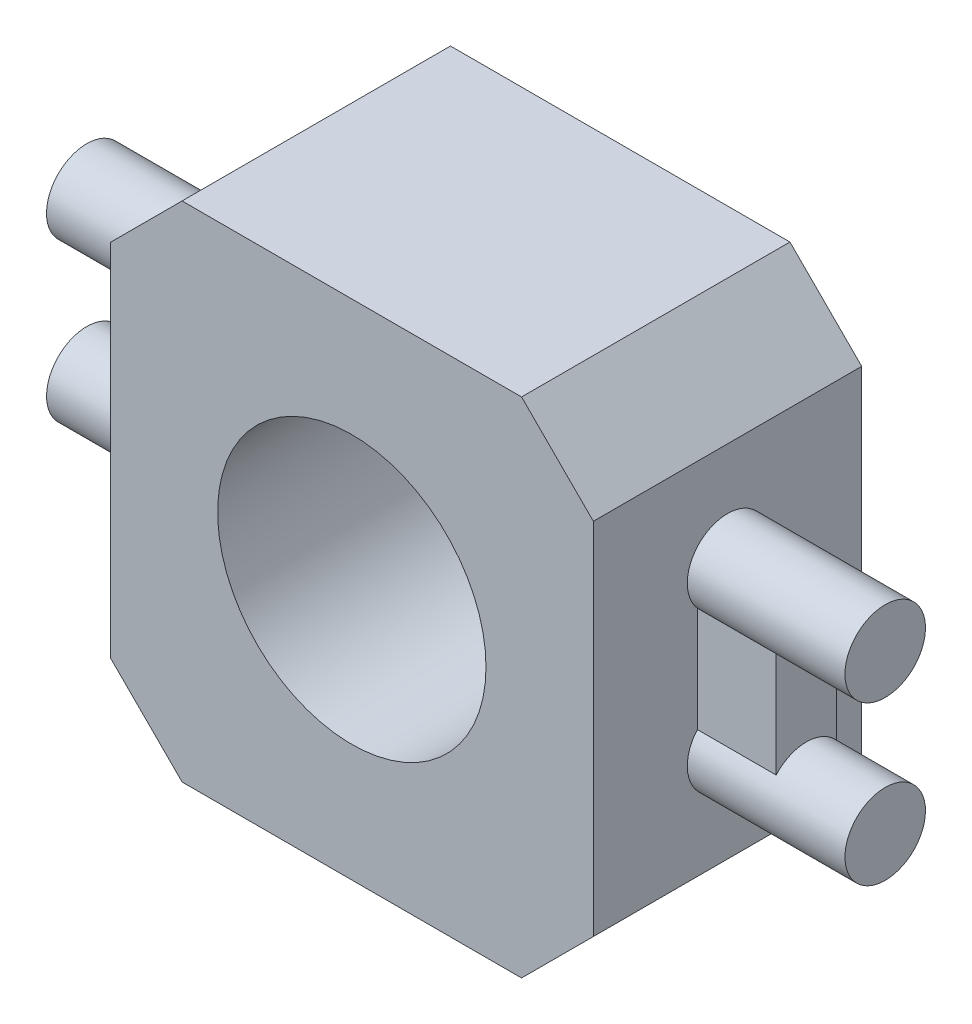
ISO-10303-21;
HEADER;
FILE_DESCRIPTION(('STEP AP214'),'2;1');
FILE_NAME('part.step','',(''),(''),'','','');
FILE_SCHEMA(('AUTOMOTIVE_DESIGN { 1 0 10303 214 1 1 1 1 }'));
ENDSEC;
DATA;
#1=APPLICATION_CONTEXT('core data for automotive mechanical design processes');
#2=APPLICATION_PROTOCOL_DEFINITION('international standard','automotive_design',2000,#1);
#3=PRODUCT_CONTEXT('',#1,'mechanical');
#4=PRODUCT('Part','Part','',(#3));
#5=PRODUCT_RELATED_PRODUCT_CATEGORY('part','',(#4));
#6=PRODUCT_DEFINITION_FORMATION('','',#4);
#7=PRODUCT_DEFINITION_CONTEXT('part definition',#1,'design');
#8=PRODUCT_DEFINITION('design','',#6,#7);
#9=PRODUCT_DEFINITION_SHAPE('','',#8);
#10=(LENGTH_UNIT() NAMED_UNIT(*) SI_UNIT(.MILLI.,.METRE.));
#11=(NAMED_UNIT(*) PLANE_ANGLE_UNIT() SI_UNIT($,.RADIAN.));
#12=(NAMED_UNIT(*) SI_UNIT($,.STERADIAN.) SOLID_ANGLE_UNIT());
#13=UNCERTAINTY_MEASURE_WITH_UNIT(LENGTH_MEASURE(1.E-05),#10,'distance_accuracy_value','');
#14=(GEOMETRIC_REPRESENTATION_CONTEXT(3) GLOBAL_UNCERTAINTY_ASSIGNED_CONTEXT((#13)) GLOBAL_UNIT_ASSIGNED_CONTEXT((#10,
#11,#12)) REPRESENTATION_CONTEXT('',''));
#15=CARTESIAN_POINT('',(0.,0.,0.));
#16=DIRECTION('',(0.,0.,1.));
#17=DIRECTION('',(1.,0.,0.));
#18=AXIS2_PLACEMENT_3D('',#15,#16,#17);
#19=CARTESIAN_POINT('',(-4.775,-1.39569752974828,1.55036098040823));
#20=DIRECTION('',(0.,0.,1.));
#21=DIRECTION('',(1.,0.,0.));
#22=AXIS2_PLACEMENT_3D('',#19,#20,#21);
#23=PLANE('',#22);
#24=DIRECTION('',(0.,-1.,0.));
#25=VECTOR('',#24,1.);
#26=CARTESIAN_POINT('',(-3.6,-1.39569752974828,1.55036098040823));
#27=LINE('',#26,#25);
#28=CARTESIAN_POINT('',(-3.6,1.13649655993792,1.55036098040823));
#29=VERTEX_POINT('',#28);
#30=CARTESIAN_POINT('',(-3.6,-1.39569752974828,1.55036098040823));
#31=VERTEX_POINT('',#30);
#32=EDGE_CURVE('E118',#29,#31,#27,.T.);
#33=ORIENTED_EDGE('',*,*,#32,.T.);
#34=DIRECTION('',(1.,0.,0.));
#35=VECTOR('',#34,1.);
#36=CARTESIAN_POINT('',(-4.775,-1.39569752974828,1.55036098040823));
#37=LINE('',#36,#35);
#38=CARTESIAN_POINT('',(-4.775,-1.39569752974828,1.55036098040823));
#39=VERTEX_POINT('',#38);
#40=EDGE_CURVE('E12',#39,#31,#37,.T.);
#41=ORIENTED_EDGE('',*,*,#40,.F.);
#42=DIRECTION('',(0.,-1.,0.));
#43=VECTOR('',#42,1.);
#44=CARTESIAN_POINT('',(-4.775,-1.39569752974828,1.55036098040823));
#45=LINE('',#44,#43);
#46=CARTESIAN_POINT('',(-4.775,1.13649655993792,1.55036098040823));
#47=VERTEX_POINT('',#46);
#48=EDGE_CURVE('E107',#47,#39,#45,.T.);
#49=ORIENTED_EDGE('',*,*,#48,.F.);
#50=DIRECTION('',(1.,0.,0.));
#51=VECTOR('',#50,1.);
#52=CARTESIAN_POINT('',(-4.775,1.13649655993792,1.55036098040823));
#53=LINE('',#52,#51);
#54=EDGE_CURVE('E117',#47,#29,#53,.T.);
#55=ORIENTED_EDGE('',*,*,#54,.T.);
#56=EDGE_LOOP('',(#33,#41,#49,#55));
#57=FACE_BOUND('',#56,.T.);
#58=ADVANCED_FACE('F60',(#57),#23,.F.);
#59=CARTESIAN_POINT('',(-4.775,-1.39569752974828,2.45036098040823));
#60=DIRECTION('',(0.,1.,0.));
#61=DIRECTION('',(0.,0.,1.));
#62=AXIS2_PLACEMENT_3D('',#59,#60,#61);
#63=PLANE('',#62);
#64=DIRECTION('',(0.,0.,1.));
#65=VECTOR('',#64,1.);
#66=CARTESIAN_POINT('',(-3.6,-1.39569752974828,2.45036098040823));
#67=LINE('',#66,#65);
#68=CARTESIAN_POINT('',(-3.6,-1.39569752974828,2.45036098040823));
#69=VERTEX_POINT('',#68);
#70=EDGE_CURVE('E115',#31,#69,#67,.T.);
#71=ORIENTED_EDGE('',*,*,#70,.T.);
#72=DIRECTION('',(1.,0.,0.));
#73=VECTOR('',#72,1.);
#74=CARTESIAN_POINT('',(-4.775,-1.39569752974828,2.45036098040823));
#75=LINE('',#74,#73);
#76=CARTESIAN_POINT('',(-4.775,-1.39569752974828,2.45036098040823));
#77=VERTEX_POINT('',#76);
#78=EDGE_CURVE('E63',#77,#69,#75,.T.);
#79=ORIENTED_EDGE('',*,*,#78,.F.);
#80=DIRECTION('',(0.,0.,1.));
#81=VECTOR('',#80,1.);
#82=CARTESIAN_POINT('',(-4.775,-1.39569752974828,2.45036098040823));
#83=LINE('',#82,#81);
#84=EDGE_CURVE('E103',#39,#77,#83,.T.);
#85=ORIENTED_EDGE('',*,*,#84,.F.);
#86=ORIENTED_EDGE('',*,*,#40,.T.);
#87=EDGE_LOOP('',(#71,#79,#85,#86));
#88=FACE_BOUND('',#87,.T.);
#89=ADVANCED_FACE('F112',(#88),#63,.F.);
#90=CARTESIAN_POINT('',(-4.775,-1.39569752974828,2.45036098040823));
#91=DIRECTION('',(0.,0.,-1.));
#92=DIRECTION('',(-1.,0.,0.));
#93=AXIS2_PLACEMENT_3D('',#90,#91,#92);
#94=PLANE('',#93);
#95=DIRECTION('',(0.,1.,0.));
#96=VECTOR('',#95,1.);
#97=CARTESIAN_POINT('',(-3.6,-1.39569752974828,2.45036098040823));
#98=LINE('',#97,#96);
#99=CARTESIAN_POINT('',(-3.6,1.13649655993792,2.45036098040823));
#100=VERTEX_POINT('',#99);
#101=EDGE_CURVE('E89',#69,#100,#98,.T.);
#102=ORIENTED_EDGE('',*,*,#101,.T.);
#103=DIRECTION('',(1.,0.,0.));
#104=VECTOR('',#103,1.);
#105=CARTESIAN_POINT('',(-4.775,1.13649655993792,2.45036098040823));
#106=LINE('',#105,#104);
#107=CARTESIAN_POINT('',(-4.775,1.13649655993792,2.45036098040823));
#108=VERTEX_POINT('',#107);
#109=EDGE_CURVE('E114',#108,#100,#106,.T.);
#110=ORIENTED_EDGE('',*,*,#109,.F.);
#111=DIRECTION('',(0.,1.,0.));
#112=VECTOR('',#111,1.);
#113=CARTESIAN_POINT('',(-4.775,-1.39569752974828,2.45036098040823));
#114=LINE('',#113,#112);
#115=EDGE_CURVE('E106',#77,#108,#114,.T.);
#116=ORIENTED_EDGE('',*,*,#115,.F.);
#117=ORIENTED_EDGE('',*,*,#78,.T.);
#118=EDGE_LOOP('',(#102,#110,#116,#117));
#119=FACE_BOUND('',#118,.T.);
#120=ADVANCED_FACE('F111',(#119),#94,.F.);
#121=CARTESIAN_POINT('',(-4.775,1.13649655993792,2.45036098040823));
#122=DIRECTION('',(0.,-1.,0.));
#123=DIRECTION('',(0.,0.,-1.));
#124=AXIS2_PLACEMENT_3D('',#121,#122,#123);
#125=PLANE('',#124);
#126=DIRECTION('',(0.,0.,-1.));
#127=VECTOR('',#126,1.);
#128=CARTESIAN_POINT('',(-3.6,1.13649655993792,2.45036098040823));
#129=LINE('',#128,#127);
#130=EDGE_CURVE('E96',#100,#29,#129,.T.);
#131=ORIENTED_EDGE('',*,*,#130,.T.);
#132=ORIENTED_EDGE('',*,*,#54,.F.);
#133=DIRECTION('',(0.,0.,-1.));
#134=VECTOR('',#133,1.);
#135=CARTESIAN_POINT('',(-4.775,1.13649655993792,2.45036098040823));
#136=LINE('',#135,#134);
#137=EDGE_CURVE('E71',#108,#47,#136,.T.);
#138=ORIENTED_EDGE('',*,*,#137,.F.);
#139=ORIENTED_EDGE('',*,*,#109,.T.);
#140=EDGE_LOOP('',(#131,#132,#138,#139));
#141=FACE_BOUND('',#140,.T.);
#142=ADVANCED_FACE('F130',(#141),#125,.F.);
#143=CARTESIAN_POINT('',(-4.775,0.,0.));
#144=DIRECTION('',(-1.,0.,0.));
#145=DIRECTION('',(0.,-1.,0.));
#146=AXIS2_PLACEMENT_3D('',#143,#144,#145);
#147=PLANE('',#146);
#148=ORIENTED_EDGE('',*,*,#48,.T.);
#149=ORIENTED_EDGE('',*,*,#84,.T.);
#150=ORIENTED_EDGE('',*,*,#115,.T.);
#151=ORIENTED_EDGE('',*,*,#137,.T.);
#152=EDGE_LOOP('',(#148,#149,#150,#151));
#153=FACE_BOUND('',#152,.T.);
#154=ADVANCED_FACE('F102',(#153),#147,.T.);
#155=CARTESIAN_POINT('',(-3.6,0.,0.));
#156=DIRECTION('',(-1.,0.,0.));
#157=DIRECTION('',(0.,-1.,0.));
#158=AXIS2_PLACEMENT_3D('',#155,#156,#157);
#159=PLANE('',#158);
#160=ORIENTED_EDGE('',*,*,#32,.F.);
#161=ORIENTED_EDGE('',*,*,#130,.F.);
#162=ORIENTED_EDGE('',*,*,#101,.F.);
#163=ORIENTED_EDGE('',*,*,#70,.F.);
#164=EDGE_LOOP('',(#160,#161,#162,#163));
#165=FACE_BOUND('',#164,.T.);
#166=ADVANCED_FACE('F128',(#165),#159,.F.);
#167=CLOSED_SHELL('',(#58,#89,#120,#142,#154,#166));
#168=MANIFOLD_SOLID_BREP('B2',#167);
#169=CARTESIAN_POINT('',(3.6,2.68,4.));
#170=DIRECTION('',(-1.,0.,0.));
#171=DIRECTION('',(0.,-1.,0.));
#172=AXIS2_PLACEMENT_3D('',#169,#170,#171);
#173=PLANE('',#172);
#174=DIRECTION('',(0.,1.,0.));
#175=VECTOR('',#174,1.);
#176=CARTESIAN_POINT('',(3.6,2.68,0.));
#177=LINE('',#176,#175);
#178=CARTESIAN_POINT('',(3.6,-2.68,0.));
#179=VERTEX_POINT('',#178);
#180=CARTESIAN_POINT('',(3.6,2.68,0.));
#181=VERTEX_POINT('',#180);
#182=EDGE_CURVE('E394',#179,#181,#177,.T.);
#183=ORIENTED_EDGE('',*,*,#182,.T.);
#184=DIRECTION('',(0.,0.,-1.));
#185=VECTOR('',#184,1.);
#186=CARTESIAN_POINT('',(3.6,2.68,4.));
#187=LINE('',#186,#185);
#188=CARTESIAN_POINT('',(3.6,2.68,4.));
#189=VERTEX_POINT('',#188);
#190=EDGE_CURVE('E400',#189,#181,#187,.T.);
#191=ORIENTED_EDGE('',*,*,#190,.F.);
#192=DIRECTION('',(0.,1.,0.));
#193=VECTOR('',#192,1.);
#194=CARTESIAN_POINT('',(3.6,2.68,4.));
#195=LINE('',#194,#193);
#196=CARTESIAN_POINT('',(3.6,-2.68,4.));
#197=VERTEX_POINT('',#196);
#198=EDGE_CURVE('E370',#197,#189,#195,.T.);
#199=ORIENTED_EDGE('',*,*,#198,.F.);
#200=DIRECTION('',(0.,0.,-1.));
#201=VECTOR('',#200,1.);
#202=CARTESIAN_POINT('',(3.6,-2.68,4.));
#203=LINE('',#202,#201);
#204=EDGE_CURVE('E404',#197,#179,#203,.T.);
#205=ORIENTED_EDGE('',*,*,#204,.T.);
#206=EDGE_LOOP('',(#183,#191,#199,#205));
#207=FACE_BOUND('',#206,.T.);
#208=DIRECTION('',(0.,1.,0.));
#209=VECTOR('',#208,1.);
#210=CARTESIAN_POINT('',(3.6,-1.16308127479022,1.55));
#211=LINE('',#210,#209);
#212=CARTESIAN_POINT('',(3.6,-0.783137303340311,1.55));
#213=VERTEX_POINT('',#212);
#214=CARTESIAN_POINT('',(3.6,0.783137303340313,1.55));
#215=VERTEX_POINT('',#214);
#216=EDGE_CURVE('E300',#213,#215,#211,.T.);
#217=ORIENTED_EDGE('',*,*,#216,.F.);
#218=CARTESIAN_POINT('',(3.6,-1.18,2.));
#219=DIRECTION('',(1.,0.,0.));
#220=DIRECTION('',(0.,1.,0.));
#221=AXIS2_PLACEMENT_3D('',#218,#219,#220);
#222=CIRCLE('',#221,0.6);
#223=CARTESIAN_POINT('',(3.6,-0.783137303340311,2.45));
#224=VERTEX_POINT('',#223);
#225=EDGE_CURVE('E316',#224,#213,#222,.T.);
#226=ORIENTED_EDGE('',*,*,#225,.F.);
#227=DIRECTION('',(0.,-1.,0.));
#228=VECTOR('',#227,1.);
#229=CARTESIAN_POINT('',(3.6,-1.16308127479022,2.45));
#230=LINE('',#229,#228);
#231=CARTESIAN_POINT('',(3.6,0.783137303340313,2.45));
#232=VERTEX_POINT('',#231);
#233=EDGE_CURVE('E293',#232,#224,#230,.T.);
#234=ORIENTED_EDGE('',*,*,#233,.F.);
#235=CARTESIAN_POINT('',(3.6,1.18,2.));
#236=DIRECTION('',(1.,0.,0.));
#237=DIRECTION('',(0.,1.,0.));
#238=AXIS2_PLACEMENT_3D('',#235,#236,#237);
#239=CIRCLE('',#238,0.6);
#240=EDGE_CURVE('E273',#215,#232,#239,.T.);
#241=ORIENTED_EDGE('',*,*,#240,.F.);
#242=EDGE_LOOP('',(#217,#226,#234,#241));
#243=FACE_BOUND('',#242,.T.);
#244=ADVANCED_FACE('F182',(#207,#243),#173,.F.);
#245=CARTESIAN_POINT('',(5.95,-1.18,2.));
#246=DIRECTION('',(-1.,0.,0.));
#247=DIRECTION('',(0.,-1.,0.));
#248=AXIS2_PLACEMENT_3D('',#245,#246,#247);
#249=CYLINDRICAL_SURFACE('',#248,0.6);
#250=CARTESIAN_POINT('',(5.95,-1.18,2.));
#251=DIRECTION('',(1.,0.,0.));
#252=DIRECTION('',(0.,1.,0.));
#253=AXIS2_PLACEMENT_3D('',#250,#251,#252);
#254=CIRCLE('',#253,0.6);
#255=CARTESIAN_POINT('',(5.95,-0.579999999999999,2.));
#256=VERTEX_POINT('',#255);
#257=EDGE_CURVE('E306',#256,#256,#254,.T.);
#258=ORIENTED_EDGE('',*,*,#257,.F.);
#259=EDGE_LOOP('',(#258));
#260=FACE_BOUND('',#259,.T.);
#261=DIRECTION('',(-1.,0.,0.));
#262=VECTOR('',#261,1.);
#263=CARTESIAN_POINT('',(5.95,-0.783137303340311,1.55));
#264=LINE('',#263,#262);
#265=CARTESIAN_POINT('',(4.775,-0.783137303340311,1.55));
#266=VERTEX_POINT('',#265);
#267=EDGE_CURVE('E197',#266,#213,#264,.T.);
#268=ORIENTED_EDGE('',*,*,#267,.F.);
#269=CARTESIAN_POINT('',(4.775,-1.18,2.));
#270=DIRECTION('',(-1.,0.,0.));
#271=DIRECTION('',(0.,0.,1.));
#272=AXIS2_PLACEMENT_3D('',#269,#270,#271);
#273=CIRCLE('',#272,0.6);
#274=CARTESIAN_POINT('',(4.775,-0.783137303340311,2.45));
#275=VERTEX_POINT('',#274);
#276=EDGE_CURVE('E203',#275,#266,#273,.T.);
#277=ORIENTED_EDGE('',*,*,#276,.F.);
#278=DIRECTION('',(-1.,0.,0.));
#279=VECTOR('',#278,1.);
#280=CARTESIAN_POINT('',(5.95,-0.78313730334031,2.45));
#281=LINE('',#280,#279);
#282=EDGE_CURVE('E288',#224,#275,#281,.F.);
#283=ORIENTED_EDGE('',*,*,#282,.F.);
#284=ORIENTED_EDGE('',*,*,#225,.T.);
#285=EDGE_LOOP('',(#268,#277,#283,#284));
#286=FACE_BOUND('',#285,.T.);
#287=ADVANCED_FACE('F478',(#260,#286),#249,.T.);
#288=CARTESIAN_POINT('',(5.95,1.18,2.));
#289=DIRECTION('',(-1.,0.,0.));
#290=DIRECTION('',(0.,-1.,0.));
#291=AXIS2_PLACEMENT_3D('',#288,#289,#290);
#292=CYLINDRICAL_SURFACE('',#291,0.6);
#293=CARTESIAN_POINT('',(5.95,1.18,2.));
#294=DIRECTION('',(1.,0.,0.));
#295=DIRECTION('',(0.,1.,0.));
#296=AXIS2_PLACEMENT_3D('',#293,#294,#295);
#297=CIRCLE('',#296,0.6);
#298=CARTESIAN_POINT('',(5.95,1.78,2.));
#299=VERTEX_POINT('',#298);
#300=EDGE_CURVE('E310',#299,#299,#297,.T.);
#301=ORIENTED_EDGE('',*,*,#300,.F.);
#302=EDGE_LOOP('',(#301));
#303=FACE_BOUND('',#302,.T.);
#304=DIRECTION('',(-1.,0.,0.));
#305=VECTOR('',#304,1.);
#306=CARTESIAN_POINT('',(5.95,0.783137303340314,1.55));
#307=LINE('',#306,#305);
#308=CARTESIAN_POINT('',(4.775,0.783137303340314,1.55));
#309=VERTEX_POINT('',#308);
#310=EDGE_CURVE('E54',#215,#309,#307,.F.);
#311=ORIENTED_EDGE('',*,*,#310,.F.);
#312=ORIENTED_EDGE('',*,*,#240,.T.);
#313=DIRECTION('',(-1.,0.,0.));
#314=VECTOR('',#313,1.);
#315=CARTESIAN_POINT('',(5.95,0.783137303340313,2.45));
#316=LINE('',#315,#314);
#317=CARTESIAN_POINT('',(4.775,0.783137303340313,2.45));
#318=VERTEX_POINT('',#317);
#319=EDGE_CURVE('E188',#318,#232,#316,.T.);
#320=ORIENTED_EDGE('',*,*,#319,.F.);
#321=CARTESIAN_POINT('',(4.775,1.18,2.));
#322=DIRECTION('',(-1.,0.,0.));
#323=DIRECTION('',(0.,0.,1.));
#324=AXIS2_PLACEMENT_3D('',#321,#322,#323);
#325=CIRCLE('',#324,0.6);
#326=EDGE_CURVE('E275',#309,#318,#325,.T.);
#327=ORIENTED_EDGE('',*,*,#326,.F.);
#328=EDGE_LOOP('',(#311,#312,#320,#327));
#329=FACE_BOUND('',#328,.T.);
#330=ADVANCED_FACE('F271',(#303,#329),#292,.T.);
#331=CARTESIAN_POINT('',(2.53,3.75,4.));
#332=DIRECTION('',(0.,-1.,0.));
#333=DIRECTION('',(1.,0.,0.));
#334=AXIS2_PLACEMENT_3D('',#331,#332,#333);
#335=PLANE('',#334);
#336=DIRECTION('',(-1.,0.,0.));
#337=VECTOR('',#336,1.);
#338=CARTESIAN_POINT('',(2.53,3.75,0.));
#339=LINE('',#338,#337);
#340=CARTESIAN_POINT('',(2.53,3.75,0.));
#341=VERTEX_POINT('',#340);
#342=CARTESIAN_POINT('',(-2.53,3.75,0.));
#343=VERTEX_POINT('',#342);
#344=EDGE_CURVE('E344',#341,#343,#339,.T.);
#345=ORIENTED_EDGE('',*,*,#344,.T.);
#346=DIRECTION('',(0.,0.,-1.));
#347=VECTOR('',#346,1.);
#348=CARTESIAN_POINT('',(-2.53,3.75,4.));
#349=LINE('',#348,#347);
#350=CARTESIAN_POINT('',(-2.53,3.75,4.));
#351=VERTEX_POINT('',#350);
#352=EDGE_CURVE('E333',#351,#343,#349,.T.);
#353=ORIENTED_EDGE('',*,*,#352,.F.);
#354=DIRECTION('',(-1.,0.,0.));
#355=VECTOR('',#354,1.);
#356=CARTESIAN_POINT('',(2.53,3.75,4.));
#357=LINE('',#356,#355);
#358=CARTESIAN_POINT('',(2.53,3.75,4.));
#359=VERTEX_POINT('',#358);
#360=EDGE_CURVE('E350',#359,#351,#357,.T.);
#361=ORIENTED_EDGE('',*,*,#360,.F.);
#362=DIRECTION('',(0.,0.,-1.));
#363=VECTOR('',#362,1.);
#364=CARTESIAN_POINT('',(2.53,3.75,4.));
#365=LINE('',#364,#363);
#366=EDGE_CURVE('E373',#359,#341,#365,.T.);
#367=ORIENTED_EDGE('',*,*,#366,.T.);
#368=EDGE_LOOP('',(#345,#353,#361,#367));
#369=FACE_BOUND('',#368,.T.);
#370=ADVANCED_FACE('F181',(#369),#335,.F.);
#371=CARTESIAN_POINT('',(-2.53,3.75,4.));
#372=DIRECTION('',(0.707106781186547,-0.707106781186547,0.));
#373=DIRECTION('',(0.707106781186548,0.707106781186548,0.));
#374=AXIS2_PLACEMENT_3D('',#371,#372,#373);
#375=PLANE('',#374);
#376=DIRECTION('',(-0.707106781186548,-0.707106781186548,0.));
#377=VECTOR('',#376,1.);
#378=CARTESIAN_POINT('',(-2.53,3.75,0.));
#379=LINE('',#378,#377);
#380=CARTESIAN_POINT('',(-3.6,2.68,0.));
#381=VERTEX_POINT('',#380);
#382=EDGE_CURVE('E380',#343,#381,#379,.T.);
#383=ORIENTED_EDGE('',*,*,#382,.T.);
#384=DIRECTION('',(0.,0.,-1.));
#385=VECTOR('',#384,1.);
#386=CARTESIAN_POINT('',(-3.6,2.68,4.));
#387=LINE('',#386,#385);
#388=CARTESIAN_POINT('',(-3.6,2.68,4.));
#389=VERTEX_POINT('',#388);
#390=EDGE_CURVE('E419',#389,#381,#387,.T.);
#391=ORIENTED_EDGE('',*,*,#390,.F.);
#392=DIRECTION('',(-0.707106781186548,-0.707106781186548,0.));
#393=VECTOR('',#392,1.);
#394=CARTESIAN_POINT('',(-2.53,3.75,4.));
#395=LINE('',#394,#393);
#396=EDGE_CURVE('E352',#351,#389,#395,.T.);
#397=ORIENTED_EDGE('',*,*,#396,.F.);
#398=ORIENTED_EDGE('',*,*,#352,.T.);
#399=EDGE_LOOP('',(#383,#391,#397,#398));
#400=FACE_BOUND('',#399,.T.);
#401=ADVANCED_FACE('F428',(#400),#375,.F.);
#402=CARTESIAN_POINT('',(-3.6,2.68,4.));
#403=DIRECTION('',(1.,0.,0.));
#404=DIRECTION('',(0.,1.,0.));
#405=AXIS2_PLACEMENT_3D('',#402,#403,#404);
#406=PLANE('',#405);
#407=CARTESIAN_POINT('',(-3.6,1.18,2.00036098040823));
#408=DIRECTION('',(-1.,0.,0.));
#409=DIRECTION('',(0.,-1.,0.));
#410=AXIS2_PLACEMENT_3D('',#407,#408,#409);
#411=CIRCLE('',#410,0.6);
#412=CARTESIAN_POINT('',(-3.6,0.58,2.00036098040823));
#413=VERTEX_POINT('',#412);
#414=EDGE_CURVE('E317',#413,#413,#411,.T.);
#415=ORIENTED_EDGE('',*,*,#414,.F.);
#416=EDGE_LOOP('',(#415));
#417=FACE_BOUND('',#416,.T.);
#418=CARTESIAN_POINT('',(-3.6,-1.18,2.));
#419=DIRECTION('',(-1.,0.,0.));
#420=DIRECTION('',(0.,-1.,0.));
#421=AXIS2_PLACEMENT_3D('',#418,#419,#420);
#422=CIRCLE('',#421,0.6);
#423=CARTESIAN_POINT('',(-3.6,-1.78,2.));
#424=VERTEX_POINT('',#423);
#425=EDGE_CURVE('E332',#424,#424,#422,.T.);
#426=ORIENTED_EDGE('',*,*,#425,.F.);
#427=EDGE_LOOP('',(#426));
#428=FACE_BOUND('',#427,.T.);
#429=DIRECTION('',(0.,-1.,0.));
#430=VECTOR('',#429,1.);
#431=CARTESIAN_POINT('',(-3.6,2.68,0.));
#432=LINE('',#431,#430);
#433=CARTESIAN_POINT('',(-3.6,-2.68,0.));
#434=VERTEX_POINT('',#433);
#435=EDGE_CURVE('E379',#381,#434,#432,.T.);
#436=ORIENTED_EDGE('',*,*,#435,.T.);
#437=DIRECTION('',(0.,0.,-1.));
#438=VECTOR('',#437,1.);
#439=CARTESIAN_POINT('',(-3.6,-2.68,4.));
#440=LINE('',#439,#438);
#441=CARTESIAN_POINT('',(-3.6,-2.68,4.));
#442=VERTEX_POINT('',#441);
#443=EDGE_CURVE('E418',#442,#434,#440,.T.);
#444=ORIENTED_EDGE('',*,*,#443,.F.);
#445=DIRECTION('',(0.,-1.,0.));
#446=VECTOR('',#445,1.);
#447=CARTESIAN_POINT('',(-3.6,2.68,4.));
#448=LINE('',#447,#446);
#449=EDGE_CURVE('E353',#389,#442,#448,.T.);
#450=ORIENTED_EDGE('',*,*,#449,.F.);
#451=ORIENTED_EDGE('',*,*,#390,.T.);
#452=EDGE_LOOP('',(#436,#444,#450,#451));
#453=FACE_BOUND('',#452,.T.);
#454=ADVANCED_FACE('F444',(#417,#428,#453),#406,.F.);
#455=CARTESIAN_POINT('',(-2.53,-3.75,4.));
#456=DIRECTION('',(0.707106781186547,0.707106781186547,0.));
#457=DIRECTION('',(-0.707106781186548,0.707106781186548,0.));
#458=AXIS2_PLACEMENT_3D('',#455,#456,#457);
#459=PLANE('',#458);
#460=DIRECTION('',(0.707106781186548,-0.707106781186548,0.));
#461=VECTOR('',#460,1.);
#462=CARTESIAN_POINT('',(-2.53,-3.75,0.));
#463=LINE('',#462,#461);
#464=CARTESIAN_POINT('',(-2.53,-3.75,0.));
#465=VERTEX_POINT('',#464);
#466=EDGE_CURVE('E382',#434,#465,#463,.T.);
#467=ORIENTED_EDGE('',*,*,#466,.T.);
#468=DIRECTION('',(0.,0.,-1.));
#469=VECTOR('',#468,1.);
#470=CARTESIAN_POINT('',(-2.53,-3.75,4.));
#471=LINE('',#470,#469);
#472=CARTESIAN_POINT('',(-2.53,-3.75,4.));
#473=VERTEX_POINT('',#472);
#474=EDGE_CURVE('E412',#473,#465,#471,.T.);
#475=ORIENTED_EDGE('',*,*,#474,.F.);
#476=DIRECTION('',(0.707106781186548,-0.707106781186548,0.));
#477=VECTOR('',#476,1.);
#478=CARTESIAN_POINT('',(-2.53,-3.75,4.));
#479=LINE('',#478,#477);
#480=EDGE_CURVE('E359',#442,#473,#479,.T.);
#481=ORIENTED_EDGE('',*,*,#480,.F.);
#482=ORIENTED_EDGE('',*,*,#443,.T.);
#483=EDGE_LOOP('',(#467,#475,#481,#482));
#484=FACE_BOUND('',#483,.T.);
#485=ADVANCED_FACE('F449',(#484),#459,.F.);
#486=CARTESIAN_POINT('',(2.53,-3.75,4.));
#487=DIRECTION('',(0.,1.,0.));
#488=DIRECTION('',(-1.,0.,0.));
#489=AXIS2_PLACEMENT_3D('',#486,#487,#488);
#490=PLANE('',#489);
#491=DIRECTION('',(1.,0.,0.));
#492=VECTOR('',#491,1.);
#493=CARTESIAN_POINT('',(2.53,-3.75,0.));
#494=LINE('',#493,#492);
#495=CARTESIAN_POINT('',(2.53,-3.75,0.));
#496=VERTEX_POINT('',#495);
#497=EDGE_CURVE('E387',#465,#496,#494,.T.);
#498=ORIENTED_EDGE('',*,*,#497,.T.);
#499=DIRECTION('',(0.,0.,-1.));
#500=VECTOR('',#499,1.);
#501=CARTESIAN_POINT('',(2.53,-3.75,4.));
#502=LINE('',#501,#500);
#503=CARTESIAN_POINT('',(2.53,-3.75,4.));
#504=VERTEX_POINT('',#503);
#505=EDGE_CURVE('E410',#504,#496,#502,.T.);
#506=ORIENTED_EDGE('',*,*,#505,.F.);
#507=DIRECTION('',(1.,0.,0.));
#508=VECTOR('',#507,1.);
#509=CARTESIAN_POINT('',(2.53,-3.75,4.));
#510=LINE('',#509,#508);
#511=EDGE_CURVE('E363',#473,#504,#510,.T.);
#512=ORIENTED_EDGE('',*,*,#511,.F.);
#513=ORIENTED_EDGE('',*,*,#474,.T.);
#514=EDGE_LOOP('',(#498,#506,#512,#513));
#515=FACE_BOUND('',#514,.T.);
#516=ADVANCED_FACE('F466',(#515),#490,.F.);
#517=CARTESIAN_POINT('',(3.6,-2.68,4.));
#518=DIRECTION('',(-0.707106781186547,0.707106781186547,0.));
#519=DIRECTION('',(-0.707106781186548,-0.707106781186548,0.));
#520=AXIS2_PLACEMENT_3D('',#517,#518,#519);
#521=PLANE('',#520);
#522=DIRECTION('',(0.707106781186548,0.707106781186548,0.));
#523=VECTOR('',#522,1.);
#524=CARTESIAN_POINT('',(3.6,-2.68,0.));
#525=LINE('',#524,#523);
#526=EDGE_CURVE('E386',#496,#179,#525,.T.);
#527=ORIENTED_EDGE('',*,*,#526,.T.);
#528=ORIENTED_EDGE('',*,*,#204,.F.);
#529=DIRECTION('',(0.707106781186548,0.707106781186548,0.));
#530=VECTOR('',#529,1.);
#531=CARTESIAN_POINT('',(3.6,-2.68,4.));
#532=LINE('',#531,#530);
#533=EDGE_CURVE('E365',#504,#197,#532,.T.);
#534=ORIENTED_EDGE('',*,*,#533,.F.);
#535=ORIENTED_EDGE('',*,*,#505,.T.);
#536=EDGE_LOOP('',(#527,#528,#534,#535));
#537=FACE_BOUND('',#536,.T.);
#538=ADVANCED_FACE('F465',(#537),#521,.F.);
#539=CARTESIAN_POINT('',(3.6,2.68,4.));
#540=DIRECTION('',(-0.707106781186547,-0.707106781186547,0.));
#541=DIRECTION('',(0.707106781186548,-0.707106781186548,0.));
#542=AXIS2_PLACEMENT_3D('',#539,#540,#541);
#543=PLANE('',#542);
#544=DIRECTION('',(-0.707106781186548,0.707106781186548,0.));
#545=VECTOR('',#544,1.);
#546=CARTESIAN_POINT('',(3.6,2.68,0.));
#547=LINE('',#546,#545);
#548=EDGE_CURVE('E354',#181,#341,#547,.T.);
#549=ORIENTED_EDGE('',*,*,#548,.T.);
#550=ORIENTED_EDGE('',*,*,#366,.F.);
#551=DIRECTION('',(-0.707106781186548,0.707106781186548,0.));
#552=VECTOR('',#551,1.);
#553=CARTESIAN_POINT('',(3.6,2.68,4.));
#554=LINE('',#553,#552);
#555=EDGE_CURVE('E367',#189,#359,#554,.T.);
#556=ORIENTED_EDGE('',*,*,#555,.F.);
#557=ORIENTED_EDGE('',*,*,#190,.T.);
#558=EDGE_LOOP('',(#549,#550,#556,#557));
#559=FACE_BOUND('',#558,.T.);
#560=ADVANCED_FACE('F460',(#559),#543,.F.);
#561=CARTESIAN_POINT('',(0.,0.,4.));
#562=DIRECTION('',(0.,0.,1.));
#563=DIRECTION('',(1.,0.,0.));
#564=AXIS2_PLACEMENT_3D('',#561,#562,#563);
#565=PLANE('',#564);
#566=CARTESIAN_POINT('',(0.,0.,4.));
#567=DIRECTION('',(0.,0.,1.));
#568=DIRECTION('',(1.,0.,0.));
#569=AXIS2_PLACEMENT_3D('',#566,#567,#568);
#570=CIRCLE('',#569,2.);
#571=CARTESIAN_POINT('',(2.,0.,4.));
#572=VERTEX_POINT('',#571);
#573=EDGE_CURVE('E330',#572,#572,#570,.T.);
#574=ORIENTED_EDGE('',*,*,#573,.F.);
#575=EDGE_LOOP('',(#574));
#576=FACE_BOUND('',#575,.T.);
#577=ORIENTED_EDGE('',*,*,#360,.T.);
#578=ORIENTED_EDGE('',*,*,#396,.T.);
#579=ORIENTED_EDGE('',*,*,#449,.T.);
#580=ORIENTED_EDGE('',*,*,#480,.T.);
#581=ORIENTED_EDGE('',*,*,#511,.T.);
#582=ORIENTED_EDGE('',*,*,#533,.T.);
#583=ORIENTED_EDGE('',*,*,#198,.T.);
#584=ORIENTED_EDGE('',*,*,#555,.T.);
#585=EDGE_LOOP('',(#577,#578,#579,#580,#581,#582,#583,#584));
#586=FACE_BOUND('',#585,.T.);
#587=ADVANCED_FACE('F451',(#576,#586),#565,.T.);
#588=CARTESIAN_POINT('',(0.,0.,0.));
#589=DIRECTION('',(0.,0.,1.));
#590=DIRECTION('',(1.,0.,0.));
#591=AXIS2_PLACEMENT_3D('',#588,#589,#590);
#592=PLANE('',#591);
#593=CARTESIAN_POINT('',(0.,0.,0.));
#594=DIRECTION('',(0.,0.,1.));
#595=DIRECTION('',(1.,0.,0.));
#596=AXIS2_PLACEMENT_3D('',#593,#594,#595);
#597=CIRCLE('',#596,2.);
#598=CARTESIAN_POINT('',(2.,0.,0.));
#599=VERTEX_POINT('',#598);
#600=EDGE_CURVE('E336',#599,#599,#597,.T.);
#601=ORIENTED_EDGE('',*,*,#600,.T.);
#602=EDGE_LOOP('',(#601));
#603=FACE_BOUND('',#602,.T.);
#604=ORIENTED_EDGE('',*,*,#344,.F.);
#605=ORIENTED_EDGE('',*,*,#548,.F.);
#606=ORIENTED_EDGE('',*,*,#182,.F.);
#607=ORIENTED_EDGE('',*,*,#526,.F.);
#608=ORIENTED_EDGE('',*,*,#497,.F.);
#609=ORIENTED_EDGE('',*,*,#466,.F.);
#610=ORIENTED_EDGE('',*,*,#435,.F.);
#611=ORIENTED_EDGE('',*,*,#382,.F.);
#612=EDGE_LOOP('',(#604,#605,#606,#607,#608,#609,#610,#611));
#613=FACE_BOUND('',#612,.T.);
#614=ADVANCED_FACE('F436',(#603,#613),#592,.F.);
#615=CARTESIAN_POINT('',(0.,0.,0.));
#616=DIRECTION('',(0.,0.,1.));
#617=DIRECTION('',(1.,0.,0.));
#618=AXIS2_PLACEMENT_3D('',#615,#616,#617);
#619=CYLINDRICAL_SURFACE('',#618,2.);
#620=ORIENTED_EDGE('',*,*,#600,.F.);
#621=EDGE_LOOP('',(#620));
#622=FACE_BOUND('',#621,.T.);
#623=ORIENTED_EDGE('',*,*,#573,.T.);
#624=EDGE_LOOP('',(#623));
#625=FACE_BOUND('',#624,.T.);
#626=ADVANCED_FACE('F487',(#622,#625),#619,.F.);
#627=CARTESIAN_POINT('',(-5.95,-1.18,2.));
#628=DIRECTION('',(1.,0.,0.));
#629=DIRECTION('',(0.,1.,0.));
#630=AXIS2_PLACEMENT_3D('',#627,#628,#629);
#631=CYLINDRICAL_SURFACE('',#630,0.6);
#632=CARTESIAN_POINT('',(-5.95,-1.18,2.));
#633=DIRECTION('',(-1.,0.,0.));
#634=DIRECTION('',(0.,-1.,0.));
#635=AXIS2_PLACEMENT_3D('',#632,#633,#634);
#636=CIRCLE('',#635,0.6);
#637=CARTESIAN_POINT('',(-5.95,-1.78,2.));
#638=VERTEX_POINT('',#637);
#639=EDGE_CURVE('E311',#638,#638,#636,.T.);
#640=ORIENTED_EDGE('',*,*,#639,.F.);
#641=EDGE_LOOP('',(#640));
#642=FACE_BOUND('',#641,.T.);
#643=ORIENTED_EDGE('',*,*,#425,.T.);
#644=EDGE_LOOP('',(#643));
#645=FACE_BOUND('',#644,.T.);
#646=ADVANCED_FACE('F497',(#642,#645),#631,.T.);
#647=CARTESIAN_POINT('',(-5.95,-1.18,2.));
#648=DIRECTION('',(-1.,0.,0.));
#649=DIRECTION('',(0.,-1.,0.));
#650=AXIS2_PLACEMENT_3D('',#647,#648,#649);
#651=PLANE('',#650);
#652=ORIENTED_EDGE('',*,*,#639,.T.);
#653=EDGE_LOOP('',(#652));
#654=FACE_BOUND('',#653,.T.);
#655=ADVANCED_FACE('F499',(#654),#651,.T.);
#656=CARTESIAN_POINT('',(-5.95,1.18,2.00036098040823));
#657=DIRECTION('',(1.,0.,0.));
#658=DIRECTION('',(0.,1.,0.));
#659=AXIS2_PLACEMENT_3D('',#656,#657,#658);
#660=CYLINDRICAL_SURFACE('',#659,0.6);
#661=CARTESIAN_POINT('',(-5.95,1.18,2.00036098040823));
#662=DIRECTION('',(-1.,0.,0.));
#663=DIRECTION('',(0.,-1.,0.));
#664=AXIS2_PLACEMENT_3D('',#661,#662,#663);
#665=CIRCLE('',#664,0.6);
#666=CARTESIAN_POINT('',(-5.95,0.58,2.00036098040823));
#667=VERTEX_POINT('',#666);
#668=EDGE_CURVE('E323',#667,#667,#665,.T.);
#669=ORIENTED_EDGE('',*,*,#668,.F.);
#670=EDGE_LOOP('',(#669));
#671=FACE_BOUND('',#670,.T.);
#672=ORIENTED_EDGE('',*,*,#414,.T.);
#673=EDGE_LOOP('',(#672));
#674=FACE_BOUND('',#673,.T.);
#675=ADVANCED_FACE('F502',(#671,#674),#660,.T.);
#676=CARTESIAN_POINT('',(-5.95,0.,0.));
#677=DIRECTION('',(-1.,0.,0.));
#678=DIRECTION('',(0.,-1.,0.));
#679=AXIS2_PLACEMENT_3D('',#676,#677,#678);
#680=PLANE('',#679);
#681=ORIENTED_EDGE('',*,*,#668,.T.);
#682=EDGE_LOOP('',(#681));
#683=FACE_BOUND('',#682,.T.);
#684=ADVANCED_FACE('F509',(#683),#680,.T.);
#685=CARTESIAN_POINT('',(5.95,-1.18,2.));
#686=DIRECTION('',(1.,0.,0.));
#687=DIRECTION('',(0.,1.,0.));
#688=AXIS2_PLACEMENT_3D('',#685,#686,#687);
#689=PLANE('',#688);
#690=ORIENTED_EDGE('',*,*,#257,.T.);
#691=EDGE_LOOP('',(#690));
#692=FACE_BOUND('',#691,.T.);
#693=ADVANCED_FACE('F515',(#692),#689,.T.);
#694=CARTESIAN_POINT('',(5.95,1.18,2.));
#695=DIRECTION('',(1.,0.,0.));
#696=DIRECTION('',(0.,1.,0.));
#697=AXIS2_PLACEMENT_3D('',#694,#695,#696);
#698=PLANE('',#697);
#699=ORIENTED_EDGE('',*,*,#300,.T.);
#700=EDGE_LOOP('',(#699));
#701=FACE_BOUND('',#700,.T.);
#702=ADVANCED_FACE('F513',(#701),#698,.T.);
#703=CARTESIAN_POINT('',(4.775,-1.16308127479022,1.55));
#704=DIRECTION('',(0.,0.,1.));
#705=DIRECTION('',(1.,0.,0.));
#706=AXIS2_PLACEMENT_3D('',#703,#704,#705);
#707=PLANE('',#706);
#708=DIRECTION('',(0.,1.,0.));
#709=VECTOR('',#708,1.);
#710=CARTESIAN_POINT('',(4.775,-1.16308127479022,1.55));
#711=LINE('',#710,#709);
#712=EDGE_CURVE('E283',#266,#309,#711,.T.);
#713=ORIENTED_EDGE('',*,*,#712,.F.);
#714=ORIENTED_EDGE('',*,*,#267,.T.);
#715=ORIENTED_EDGE('',*,*,#216,.T.);
#716=ORIENTED_EDGE('',*,*,#310,.T.);
#717=EDGE_LOOP('',(#713,#714,#715,#716));
#718=FACE_BOUND('',#717,.T.);
#719=ADVANCED_FACE('F522',(#718),#707,.F.);
#720=CARTESIAN_POINT('',(4.775,-1.16308127479022,2.45));
#721=DIRECTION('',(0.,0.,-1.));
#722=DIRECTION('',(-1.,0.,0.));
#723=AXIS2_PLACEMENT_3D('',#720,#721,#722);
#724=PLANE('',#723);
#725=ORIENTED_EDGE('',*,*,#233,.T.);
#726=ORIENTED_EDGE('',*,*,#282,.T.);
#727=DIRECTION('',(0.,-1.,0.));
#728=VECTOR('',#727,1.);
#729=CARTESIAN_POINT('',(4.775,-1.16308127479022,2.45));
#730=LINE('',#729,#728);
#731=EDGE_CURVE('E285',#318,#275,#730,.T.);
#732=ORIENTED_EDGE('',*,*,#731,.F.);
#733=ORIENTED_EDGE('',*,*,#319,.T.);
#734=EDGE_LOOP('',(#725,#726,#732,#733));
#735=FACE_BOUND('',#734,.T.);
#736=ADVANCED_FACE('F289',(#735),#724,.F.);
#737=CARTESIAN_POINT('',(4.775,0.,0.));
#738=DIRECTION('',(-1.,0.,0.));
#739=DIRECTION('',(0.,0.,1.));
#740=AXIS2_PLACEMENT_3D('',#737,#738,#739);
#741=PLANE('',#740);
#742=ORIENTED_EDGE('',*,*,#731,.T.);
#743=ORIENTED_EDGE('',*,*,#276,.T.);
#744=ORIENTED_EDGE('',*,*,#712,.T.);
#745=ORIENTED_EDGE('',*,*,#326,.T.);
#746=EDGE_LOOP('',(#742,#743,#744,#745));
#747=FACE_BOUND('',#746,.T.);
#748=ADVANCED_FACE('F284',(#747),#741,.F.);
#749=CLOSED_SHELL('',(#244,#287,#330,#370,#401,#454,#485,#516,#538,#560,#587,#614,#626,#646,
#655,#675,#684,#693,#702,#719,#736,#748));
#750=MANIFOLD_SOLID_BREP('B6',#749);
#751=ADVANCED_BREP_SHAPE_REPRESENTATION('',(#18,#168,#750),#14);
#752=SHAPE_DEFINITION_REPRESENTATION(#9,#751);
ENDSEC;
END-ISO-10303-21;
